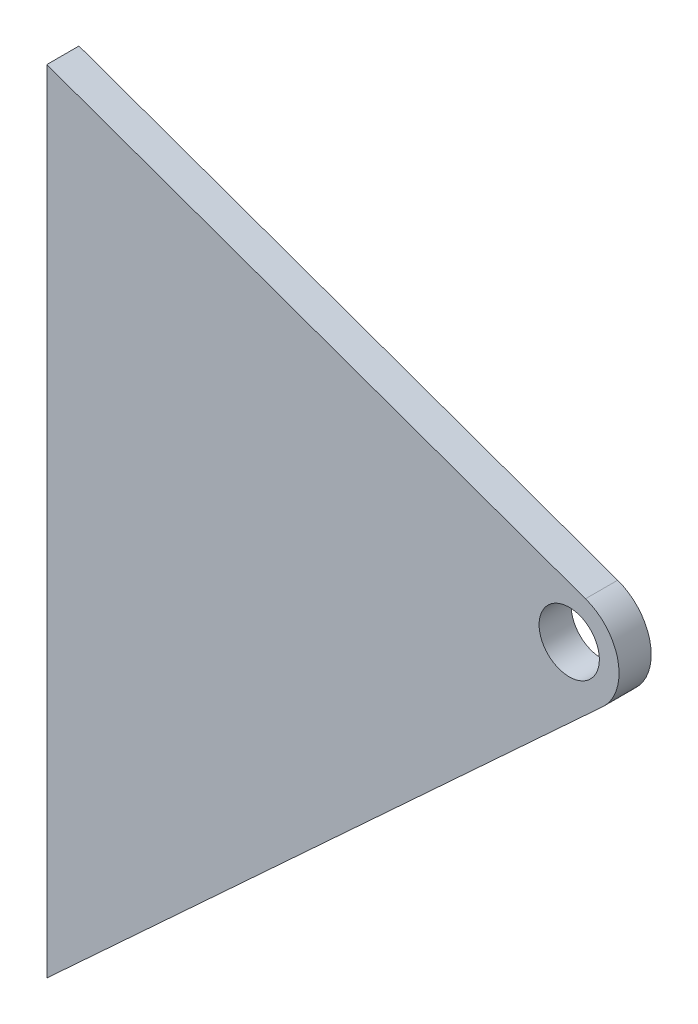
ISO-10303-21;
HEADER;
FILE_DESCRIPTION(('STEP AP214'),'2;1');
FILE_NAME('part.step','',(''),(''),'','','');
FILE_SCHEMA(('AUTOMOTIVE_DESIGN { 1 0 10303 214 1 1 1 1 }'));
ENDSEC;
DATA;
#1=APPLICATION_CONTEXT('core data for automotive mechanical design processes');
#2=APPLICATION_PROTOCOL_DEFINITION('international standard','automotive_design',2000,#1);
#3=PRODUCT_CONTEXT('',#1,'mechanical');
#4=PRODUCT('Part','Part','',(#3));
#5=PRODUCT_RELATED_PRODUCT_CATEGORY('part','',(#4));
#6=PRODUCT_DEFINITION_FORMATION('','',#4);
#7=PRODUCT_DEFINITION_CONTEXT('part definition',#1,'design');
#8=PRODUCT_DEFINITION('design','',#6,#7);
#9=PRODUCT_DEFINITION_SHAPE('','',#8);
#10=(LENGTH_UNIT() NAMED_UNIT(*) SI_UNIT(.MILLI.,.METRE.));
#11=(NAMED_UNIT(*) PLANE_ANGLE_UNIT() SI_UNIT($,.RADIAN.));
#12=(NAMED_UNIT(*) SI_UNIT($,.STERADIAN.) SOLID_ANGLE_UNIT());
#13=UNCERTAINTY_MEASURE_WITH_UNIT(LENGTH_MEASURE(1.E-05),#10,'distance_accuracy_value','');
#14=(GEOMETRIC_REPRESENTATION_CONTEXT(3) GLOBAL_UNCERTAINTY_ASSIGNED_CONTEXT((#13)) GLOBAL_UNIT_ASSIGNED_CONTEXT((#10,
#11,#12)) REPRESENTATION_CONTEXT('',''));
#15=CARTESIAN_POINT('',(0.,0.,0.));
#16=DIRECTION('',(0.,0.,1.));
#17=DIRECTION('',(1.,0.,0.));
#18=AXIS2_PLACEMENT_3D('',#15,#16,#17);
#19=CARTESIAN_POINT('',(0.,0.,10.16));
#20=DIRECTION('',(0.,0.,-1.));
#21=DIRECTION('',(-1.,0.,0.));
#22=AXIS2_PLACEMENT_3D('',#19,#20,#21);
#23=PLANE('',#22);
#24=DIRECTION('',(0.73497673497146,0.678092323397554,0.));
#25=VECTOR('',#24,1.);
#26=CARTESIAN_POINT('',(0.,0.,10.16));
#27=LINE('',#26,#25);
#28=CARTESIAN_POINT('',(0.,0.,10.16));
#29=VERTEX_POINT('',#28);
#30=CARTESIAN_POINT('',(175.694872695885,162.096755946998,10.16));
#31=VERTEX_POINT('',#30);
#32=EDGE_CURVE('E95',#29,#31,#27,.T.);
#33=ORIENTED_EDGE('',*,*,#32,.T.);
#34=CARTESIAN_POINT('',(164.845395521524,173.856383706541,10.16));
#35=DIRECTION('',(0.,0.,-1.));
#36=DIRECTION('',(-1.,0.,0.));
#37=AXIS2_PLACEMENT_3D('',#34,#35,#36);
#38=CIRCLE('',#37,16.);
#39=CARTESIAN_POINT('',(170.248776855443,188.916379395792,10.16));
#40=VERTEX_POINT('',#39);
#41=EDGE_CURVE('E11',#31,#40,#38,.F.);
#42=ORIENTED_EDGE('',*,*,#41,.T.);
#43=DIRECTION('',(-0.941249730578185,0.337711333369928,0.));
#44=VECTOR('',#43,1.);
#45=CARTESIAN_POINT('',(0.,250.,10.16));
#46=LINE('',#45,#44);
#47=CARTESIAN_POINT('',(0.,250.,10.16));
#48=VERTEX_POINT('',#47);
#49=EDGE_CURVE('E84',#40,#48,#46,.T.);
#50=ORIENTED_EDGE('',*,*,#49,.T.);
#51=DIRECTION('',(0.,-1.,0.));
#52=VECTOR('',#51,1.);
#53=CARTESIAN_POINT('',(0.,0.,10.16));
#54=LINE('',#53,#52);
#55=EDGE_CURVE('E88',#48,#29,#54,.T.);
#56=ORIENTED_EDGE('',*,*,#55,.T.);
#57=EDGE_LOOP('',(#33,#42,#50,#56));
#58=FACE_BOUND('',#57,.T.);
#59=CARTESIAN_POINT('',(165.1,174.5,10.16));
#60=DIRECTION('',(0.,0.,1.));
#61=DIRECTION('',(1.,0.,0.));
#62=AXIS2_PLACEMENT_3D('',#59,#60,#61);
#63=CIRCLE('',#62,9.52499999999999);
#64=CARTESIAN_POINT('',(174.625,174.5,10.16));
#65=VERTEX_POINT('',#64);
#66=EDGE_CURVE('E118',#65,#65,#63,.T.);
#67=ORIENTED_EDGE('',*,*,#66,.F.);
#68=EDGE_LOOP('',(#67));
#69=FACE_BOUND('',#68,.T.);
#70=ADVANCED_FACE('F43',(#58,#69),#23,.F.);
#71=CARTESIAN_POINT('',(0.,0.,0.));
#72=DIRECTION('',(0.,0.,-1.));
#73=DIRECTION('',(-1.,0.,0.));
#74=AXIS2_PLACEMENT_3D('',#71,#72,#73);
#75=PLANE('',#74);
#76=DIRECTION('',(-0.941249730578185,0.337711333369928,0.));
#77=VECTOR('',#76,1.);
#78=CARTESIAN_POINT('',(0.,250.,0.));
#79=LINE('',#78,#77);
#80=CARTESIAN_POINT('',(170.248776855443,188.916379395792,0.));
#81=VERTEX_POINT('',#80);
#82=CARTESIAN_POINT('',(0.,250.,0.));
#83=VERTEX_POINT('',#82);
#84=EDGE_CURVE('E100',#81,#83,#79,.T.);
#85=ORIENTED_EDGE('',*,*,#84,.F.);
#86=CARTESIAN_POINT('',(164.845395521524,173.856383706541,0.));
#87=DIRECTION('',(0.,0.,-1.));
#88=DIRECTION('',(-1.,0.,0.));
#89=AXIS2_PLACEMENT_3D('',#86,#87,#88);
#90=CIRCLE('',#89,16.);
#91=CARTESIAN_POINT('',(175.694872695885,162.096755946998,0.));
#92=VERTEX_POINT('',#91);
#93=EDGE_CURVE('E66',#81,#92,#90,.T.);
#94=ORIENTED_EDGE('',*,*,#93,.T.);
#95=DIRECTION('',(0.73497673497146,0.678092323397554,0.));
#96=VECTOR('',#95,1.);
#97=CARTESIAN_POINT('',(0.,0.,0.));
#98=LINE('',#97,#96);
#99=CARTESIAN_POINT('',(0.,0.,0.));
#100=VERTEX_POINT('',#99);
#101=EDGE_CURVE('E115',#100,#92,#98,.T.);
#102=ORIENTED_EDGE('',*,*,#101,.F.);
#103=DIRECTION('',(0.,-1.,0.));
#104=VECTOR('',#103,1.);
#105=CARTESIAN_POINT('',(0.,0.,0.));
#106=LINE('',#105,#104);
#107=EDGE_CURVE('E121',#83,#100,#106,.T.);
#108=ORIENTED_EDGE('',*,*,#107,.F.);
#109=EDGE_LOOP('',(#85,#94,#102,#108));
#110=FACE_BOUND('',#109,.T.);
#111=CARTESIAN_POINT('',(165.1,174.5,0.));
#112=DIRECTION('',(0.,0.,1.));
#113=DIRECTION('',(1.,0.,0.));
#114=AXIS2_PLACEMENT_3D('',#111,#112,#113);
#115=CIRCLE('',#114,9.52499999999999);
#116=CARTESIAN_POINT('',(174.625,174.5,0.));
#117=VERTEX_POINT('',#116);
#118=EDGE_CURVE('E134',#117,#117,#115,.T.);
#119=ORIENTED_EDGE('',*,*,#118,.T.);
#120=EDGE_LOOP('',(#119));
#121=FACE_BOUND('',#120,.T.);
#122=ADVANCED_FACE('F129',(#110,#121),#75,.T.);
#123=CARTESIAN_POINT('',(0.,0.,10.16));
#124=DIRECTION('',(-0.678092323397554,0.73497673497146,0.));
#125=DIRECTION('',(-0.73497673497146,-0.678092323397554,0.));
#126=AXIS2_PLACEMENT_3D('',#123,#124,#125);
#127=PLANE('',#126);
#128=ORIENTED_EDGE('',*,*,#101,.T.);
#129=DIRECTION('',(0.,0.,-1.));
#130=VECTOR('',#129,1.);
#131=CARTESIAN_POINT('',(175.694872695885,162.096755946998,10.16));
#132=LINE('',#131,#130);
#133=EDGE_CURVE('E52',#92,#31,#132,.F.);
#134=ORIENTED_EDGE('',*,*,#133,.T.);
#135=ORIENTED_EDGE('',*,*,#32,.F.);
#136=DIRECTION('',(0.,0.,-1.));
#137=VECTOR('',#136,1.);
#138=CARTESIAN_POINT('',(0.,0.,10.16));
#139=LINE('',#138,#137);
#140=EDGE_CURVE('E105',#29,#100,#139,.T.);
#141=ORIENTED_EDGE('',*,*,#140,.T.);
#142=EDGE_LOOP('',(#128,#134,#135,#141));
#143=FACE_BOUND('',#142,.T.);
#144=ADVANCED_FACE('F131',(#143),#127,.F.);
#145=CARTESIAN_POINT('',(0.,250.,10.16));
#146=DIRECTION('',(-0.337711333369928,-0.941249730578185,0.));
#147=DIRECTION('',(0.941249730578185,-0.337711333369928,0.));
#148=AXIS2_PLACEMENT_3D('',#145,#146,#147);
#149=PLANE('',#148);
#150=ORIENTED_EDGE('',*,*,#49,.F.);
#151=DIRECTION('',(0.,0.,-1.));
#152=VECTOR('',#151,1.);
#153=CARTESIAN_POINT('',(170.248776855443,188.916379395792,10.16));
#154=LINE('',#153,#152);
#155=EDGE_CURVE('E104',#40,#81,#154,.T.);
#156=ORIENTED_EDGE('',*,*,#155,.T.);
#157=ORIENTED_EDGE('',*,*,#84,.T.);
#158=DIRECTION('',(0.,0.,-1.));
#159=VECTOR('',#158,1.);
#160=CARTESIAN_POINT('',(0.,250.,10.16));
#161=LINE('',#160,#159);
#162=EDGE_CURVE('E98',#48,#83,#161,.T.);
#163=ORIENTED_EDGE('',*,*,#162,.F.);
#164=EDGE_LOOP('',(#150,#156,#157,#163));
#165=FACE_BOUND('',#164,.T.);
#166=ADVANCED_FACE('F99',(#165),#149,.F.);
#167=CARTESIAN_POINT('',(0.,0.,10.16));
#168=DIRECTION('',(1.,0.,0.));
#169=DIRECTION('',(0.,1.,0.));
#170=AXIS2_PLACEMENT_3D('',#167,#168,#169);
#171=PLANE('',#170);
#172=ORIENTED_EDGE('',*,*,#107,.T.);
#173=ORIENTED_EDGE('',*,*,#140,.F.);
#174=ORIENTED_EDGE('',*,*,#55,.F.);
#175=ORIENTED_EDGE('',*,*,#162,.T.);
#176=EDGE_LOOP('',(#172,#173,#174,#175));
#177=FACE_BOUND('',#176,.T.);
#178=ADVANCED_FACE('F107',(#177),#171,.F.);
#179=CARTESIAN_POINT('',(165.1,174.5,10.16));
#180=DIRECTION('',(0.,0.,-1.));
#181=DIRECTION('',(-1.,0.,0.));
#182=AXIS2_PLACEMENT_3D('',#179,#180,#181);
#183=CYLINDRICAL_SURFACE('',#182,9.52499999999999);
#184=ORIENTED_EDGE('',*,*,#66,.T.);
#185=EDGE_LOOP('',(#184));
#186=FACE_BOUND('',#185,.T.);
#187=ORIENTED_EDGE('',*,*,#118,.F.);
#188=EDGE_LOOP('',(#187));
#189=FACE_BOUND('',#188,.T.);
#190=ADVANCED_FACE('F142',(#186,#189),#183,.F.);
#191=CARTESIAN_POINT('',(164.845395521524,173.856383706541,10.16));
#192=DIRECTION('',(0.,0.,-1.));
#193=DIRECTION('',(-1.,0.,0.));
#194=AXIS2_PLACEMENT_3D('',#191,#192,#193);
#195=CYLINDRICAL_SURFACE('',#194,16.);
#196=ORIENTED_EDGE('',*,*,#41,.F.);
#197=ORIENTED_EDGE('',*,*,#133,.F.);
#198=ORIENTED_EDGE('',*,*,#93,.F.);
#199=ORIENTED_EDGE('',*,*,#155,.F.);
#200=EDGE_LOOP('',(#196,#197,#198,#199));
#201=FACE_BOUND('',#200,.T.);
#202=ADVANCED_FACE('F45',(#201),#195,.T.);
#203=CLOSED_SHELL('',(#70,#122,#144,#166,#178,#190,#202));
#204=MANIFOLD_SOLID_BREP('B2',#203);
#205=ADVANCED_BREP_SHAPE_REPRESENTATION('',(#18,#204),#14);
#206=SHAPE_DEFINITION_REPRESENTATION(#9,#205);
ENDSEC;
END-ISO-10303-21;
